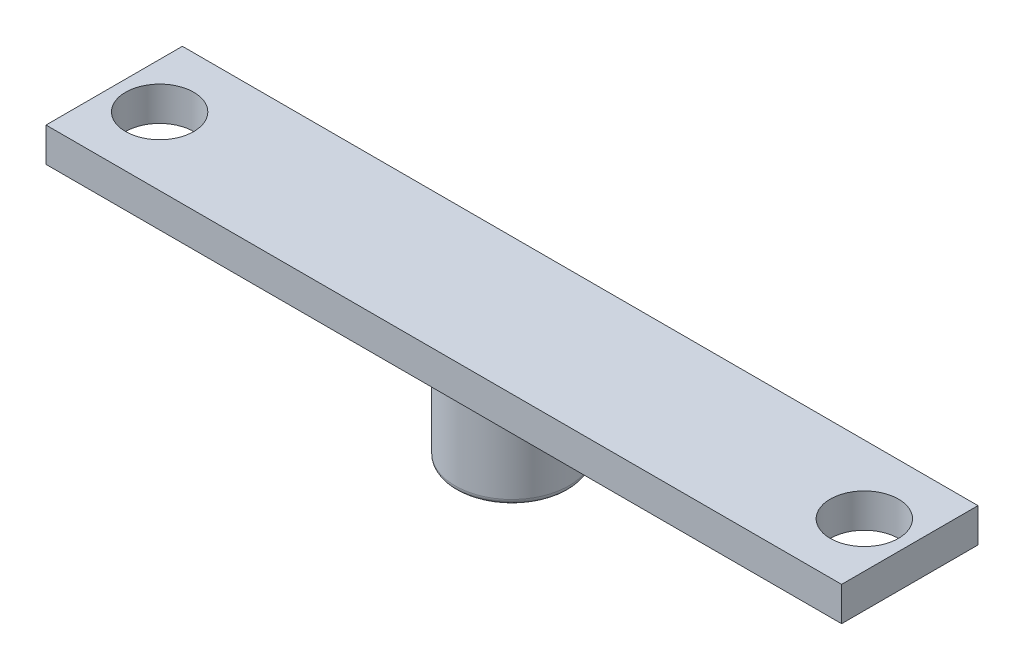
ISO-10303-21;
HEADER;
FILE_DESCRIPTION(('STEP AP214'),'2;1');
FILE_NAME('part.step','',(''),(''),'','','');
FILE_SCHEMA(('AUTOMOTIVE_DESIGN { 1 0 10303 214 1 1 1 1 }'));
ENDSEC;
DATA;
#1=APPLICATION_CONTEXT('core data for automotive mechanical design processes');
#2=APPLICATION_PROTOCOL_DEFINITION('international standard','automotive_design',2000,#1);
#3=PRODUCT_CONTEXT('',#1,'mechanical');
#4=PRODUCT('Part','Part','',(#3));
#5=PRODUCT_RELATED_PRODUCT_CATEGORY('part','',(#4));
#6=PRODUCT_DEFINITION_FORMATION('','',#4);
#7=PRODUCT_DEFINITION_CONTEXT('part definition',#1,'design');
#8=PRODUCT_DEFINITION('design','',#6,#7);
#9=PRODUCT_DEFINITION_SHAPE('','',#8);
#10=(LENGTH_UNIT() NAMED_UNIT(*) SI_UNIT(.MILLI.,.METRE.));
#11=(NAMED_UNIT(*) PLANE_ANGLE_UNIT() SI_UNIT($,.RADIAN.));
#12=(NAMED_UNIT(*) SI_UNIT($,.STERADIAN.) SOLID_ANGLE_UNIT());
#13=UNCERTAINTY_MEASURE_WITH_UNIT(LENGTH_MEASURE(1.E-05),#10,'distance_accuracy_value','');
#14=(GEOMETRIC_REPRESENTATION_CONTEXT(3) GLOBAL_UNCERTAINTY_ASSIGNED_CONTEXT((#13)) GLOBAL_UNIT_ASSIGNED_CONTEXT((#10,
#11,#12)) REPRESENTATION_CONTEXT('',''));
#15=CARTESIAN_POINT('',(0.,0.,0.));
#16=DIRECTION('',(0.,0.,1.));
#17=DIRECTION('',(1.,0.,0.));
#18=AXIS2_PLACEMENT_3D('',#15,#16,#17);
#19=CARTESIAN_POINT('',(35.,3.,6.));
#20=DIRECTION('',(-1.,0.,0.));
#21=DIRECTION('',(0.,0.,1.));
#22=AXIS2_PLACEMENT_3D('',#19,#20,#21);
#23=PLANE('',#22);
#24=DIRECTION('',(0.,0.,-1.));
#25=VECTOR('',#24,1.);
#26=CARTESIAN_POINT('',(35.,0.,6.));
#27=LINE('',#26,#25);
#28=CARTESIAN_POINT('',(35.,0.,6.));
#29=VERTEX_POINT('',#28);
#30=CARTESIAN_POINT('',(35.,0.,-6.));
#31=VERTEX_POINT('',#30);
#32=EDGE_CURVE('E110',#29,#31,#27,.T.);
#33=ORIENTED_EDGE('',*,*,#32,.T.);
#34=DIRECTION('',(0.,-1.,0.));
#35=VECTOR('',#34,1.);
#36=CARTESIAN_POINT('',(35.,3.,-6.));
#37=LINE('',#36,#35);
#38=CARTESIAN_POINT('',(35.,3.,-6.));
#39=VERTEX_POINT('',#38);
#40=EDGE_CURVE('E98',#39,#31,#37,.T.);
#41=ORIENTED_EDGE('',*,*,#40,.F.);
#42=DIRECTION('',(0.,0.,-1.));
#43=VECTOR('',#42,1.);
#44=CARTESIAN_POINT('',(35.,3.,6.));
#45=LINE('',#44,#43);
#46=CARTESIAN_POINT('',(35.,3.,6.));
#47=VERTEX_POINT('',#46);
#48=EDGE_CURVE('E95',#47,#39,#45,.T.);
#49=ORIENTED_EDGE('',*,*,#48,.F.);
#50=DIRECTION('',(0.,-1.,0.));
#51=VECTOR('',#50,1.);
#52=CARTESIAN_POINT('',(35.,3.,6.));
#53=LINE('',#52,#51);
#54=EDGE_CURVE('E103',#47,#29,#53,.T.);
#55=ORIENTED_EDGE('',*,*,#54,.T.);
#56=EDGE_LOOP('',(#33,#41,#49,#55));
#57=FACE_BOUND('',#56,.T.);
#58=ADVANCED_FACE('F39',(#57),#23,.F.);
#59=CARTESIAN_POINT('',(-35.,3.,-6.));
#60=DIRECTION('',(0.,0.,1.));
#61=DIRECTION('',(1.,0.,0.));
#62=AXIS2_PLACEMENT_3D('',#59,#60,#61);
#63=PLANE('',#62);
#64=DIRECTION('',(-1.,0.,0.));
#65=VECTOR('',#64,1.);
#66=CARTESIAN_POINT('',(-35.,0.,-6.));
#67=LINE('',#66,#65);
#68=CARTESIAN_POINT('',(-35.,0.,-6.));
#69=VERTEX_POINT('',#68);
#70=EDGE_CURVE('E100',#31,#69,#67,.T.);
#71=ORIENTED_EDGE('',*,*,#70,.T.);
#72=DIRECTION('',(0.,-1.,0.));
#73=VECTOR('',#72,1.);
#74=CARTESIAN_POINT('',(-35.,3.,-6.));
#75=LINE('',#74,#73);
#76=CARTESIAN_POINT('',(-35.,3.,-6.));
#77=VERTEX_POINT('',#76);
#78=EDGE_CURVE('E92',#77,#69,#75,.T.);
#79=ORIENTED_EDGE('',*,*,#78,.F.);
#80=DIRECTION('',(-1.,0.,0.));
#81=VECTOR('',#80,1.);
#82=CARTESIAN_POINT('',(-35.,3.,-6.));
#83=LINE('',#82,#81);
#84=EDGE_CURVE('E87',#39,#77,#83,.T.);
#85=ORIENTED_EDGE('',*,*,#84,.F.);
#86=ORIENTED_EDGE('',*,*,#40,.T.);
#87=EDGE_LOOP('',(#71,#79,#85,#86));
#88=FACE_BOUND('',#87,.T.);
#89=ADVANCED_FACE('F96',(#88),#63,.F.);
#90=CARTESIAN_POINT('',(-35.,3.,6.));
#91=DIRECTION('',(1.,0.,0.));
#92=DIRECTION('',(0.,0.,-1.));
#93=AXIS2_PLACEMENT_3D('',#90,#91,#92);
#94=PLANE('',#93);
#95=DIRECTION('',(0.,0.,1.));
#96=VECTOR('',#95,1.);
#97=CARTESIAN_POINT('',(-35.,0.,6.));
#98=LINE('',#97,#96);
#99=CARTESIAN_POINT('',(-35.,0.,6.));
#100=VERTEX_POINT('',#99);
#101=EDGE_CURVE('E71',#69,#100,#98,.T.);
#102=ORIENTED_EDGE('',*,*,#101,.T.);
#103=DIRECTION('',(0.,-1.,0.));
#104=VECTOR('',#103,1.);
#105=CARTESIAN_POINT('',(-35.,3.,6.));
#106=LINE('',#105,#104);
#107=CARTESIAN_POINT('',(-35.,3.,6.));
#108=VERTEX_POINT('',#107);
#109=EDGE_CURVE('E97',#108,#100,#106,.T.);
#110=ORIENTED_EDGE('',*,*,#109,.F.);
#111=DIRECTION('',(0.,0.,1.));
#112=VECTOR('',#111,1.);
#113=CARTESIAN_POINT('',(-35.,3.,6.));
#114=LINE('',#113,#112);
#115=EDGE_CURVE('E89',#77,#108,#114,.T.);
#116=ORIENTED_EDGE('',*,*,#115,.F.);
#117=ORIENTED_EDGE('',*,*,#78,.T.);
#118=EDGE_LOOP('',(#102,#110,#116,#117));
#119=FACE_BOUND('',#118,.T.);
#120=ADVANCED_FACE('F101',(#119),#94,.F.);
#121=CARTESIAN_POINT('',(-35.,3.,6.));
#122=DIRECTION('',(0.,0.,-1.));
#123=DIRECTION('',(-1.,0.,0.));
#124=AXIS2_PLACEMENT_3D('',#121,#122,#123);
#125=PLANE('',#124);
#126=DIRECTION('',(1.,0.,0.));
#127=VECTOR('',#126,1.);
#128=CARTESIAN_POINT('',(-35.,0.,6.));
#129=LINE('',#128,#127);
#130=EDGE_CURVE('E78',#100,#29,#129,.T.);
#131=ORIENTED_EDGE('',*,*,#130,.T.);
#132=ORIENTED_EDGE('',*,*,#54,.F.);
#133=DIRECTION('',(1.,0.,0.));
#134=VECTOR('',#133,1.);
#135=CARTESIAN_POINT('',(-35.,3.,6.));
#136=LINE('',#135,#134);
#137=EDGE_CURVE('E57',#108,#47,#136,.T.);
#138=ORIENTED_EDGE('',*,*,#137,.F.);
#139=ORIENTED_EDGE('',*,*,#109,.T.);
#140=EDGE_LOOP('',(#131,#132,#138,#139));
#141=FACE_BOUND('',#140,.T.);
#142=ADVANCED_FACE('F157',(#141),#125,.F.);
#143=CARTESIAN_POINT('',(0.,3.,0.));
#144=DIRECTION('',(0.,-1.,0.));
#145=DIRECTION('',(0.,0.,-1.));
#146=AXIS2_PLACEMENT_3D('',#143,#144,#145);
#147=PLANE('',#146);
#148=CARTESIAN_POINT('',(31.,3.,0.));
#149=DIRECTION('',(0.,1.,0.));
#150=DIRECTION('',(0.,0.,1.));
#151=AXIS2_PLACEMENT_3D('',#148,#149,#150);
#152=CIRCLE('',#151,3.);
#153=CARTESIAN_POINT('',(31.,3.,2.99999999999999));
#154=VERTEX_POINT('',#153);
#155=EDGE_CURVE('E178',#154,#154,#152,.T.);
#156=ORIENTED_EDGE('',*,*,#155,.F.);
#157=EDGE_LOOP('',(#156));
#158=FACE_BOUND('',#157,.T.);
#159=CARTESIAN_POINT('',(-31.,3.,0.));
#160=DIRECTION('',(0.,1.,0.));
#161=DIRECTION('',(0.,0.,1.));
#162=AXIS2_PLACEMENT_3D('',#159,#160,#161);
#163=CIRCLE('',#162,3.);
#164=CARTESIAN_POINT('',(-31.,3.,3.));
#165=VERTEX_POINT('',#164);
#166=EDGE_CURVE('E182',#165,#165,#163,.T.);
#167=ORIENTED_EDGE('',*,*,#166,.F.);
#168=EDGE_LOOP('',(#167));
#169=FACE_BOUND('',#168,.T.);
#170=ORIENTED_EDGE('',*,*,#48,.T.);
#171=ORIENTED_EDGE('',*,*,#84,.T.);
#172=ORIENTED_EDGE('',*,*,#115,.T.);
#173=ORIENTED_EDGE('',*,*,#137,.T.);
#174=EDGE_LOOP('',(#170,#171,#172,#173));
#175=FACE_BOUND('',#174,.T.);
#176=ADVANCED_FACE('F86',(#158,#169,#175),#147,.F.);
#177=CARTESIAN_POINT('',(0.,0.,0.));
#178=DIRECTION('',(0.,-1.,0.));
#179=DIRECTION('',(0.,0.,-1.));
#180=AXIS2_PLACEMENT_3D('',#177,#178,#179);
#181=PLANE('',#180);
#182=CARTESIAN_POINT('',(0.,0.,0.));
#183=DIRECTION('',(0.,-1.,0.));
#184=DIRECTION('',(0.,0.,-1.));
#185=AXIS2_PLACEMENT_3D('',#182,#183,#184);
#186=CIRCLE('',#185,5.5);
#187=CARTESIAN_POINT('',(0.,0.,-5.5));
#188=VERTEX_POINT('',#187);
#189=EDGE_CURVE('E48',#188,#188,#186,.F.);
#190=ORIENTED_EDGE('',*,*,#189,.T.);
#191=EDGE_LOOP('',(#190));
#192=FACE_BOUND('',#191,.T.);
#193=CARTESIAN_POINT('',(31.,0.,0.));
#194=DIRECTION('',(0.,1.,0.));
#195=DIRECTION('',(0.,0.,1.));
#196=AXIS2_PLACEMENT_3D('',#193,#194,#195);
#197=CIRCLE('',#196,3.);
#198=CARTESIAN_POINT('',(31.,0.,2.99999999999999));
#199=VERTEX_POINT('',#198);
#200=EDGE_CURVE('E109',#199,#199,#197,.T.);
#201=ORIENTED_EDGE('',*,*,#200,.T.);
#202=EDGE_LOOP('',(#201));
#203=FACE_BOUND('',#202,.T.);
#204=CARTESIAN_POINT('',(-31.,0.,0.));
#205=DIRECTION('',(0.,1.,0.));
#206=DIRECTION('',(0.,0.,1.));
#207=AXIS2_PLACEMENT_3D('',#204,#205,#206);
#208=CIRCLE('',#207,3.);
#209=CARTESIAN_POINT('',(-31.,0.,3.));
#210=VERTEX_POINT('',#209);
#211=EDGE_CURVE('E183',#210,#210,#208,.T.);
#212=ORIENTED_EDGE('',*,*,#211,.T.);
#213=EDGE_LOOP('',(#212));
#214=FACE_BOUND('',#213,.T.);
#215=ORIENTED_EDGE('',*,*,#32,.F.);
#216=ORIENTED_EDGE('',*,*,#130,.F.);
#217=ORIENTED_EDGE('',*,*,#101,.F.);
#218=ORIENTED_EDGE('',*,*,#70,.F.);
#219=EDGE_LOOP('',(#215,#216,#217,#218));
#220=FACE_BOUND('',#219,.T.);
#221=ADVANCED_FACE('F123',(#192,#203,#214,#220),#181,.T.);
#222=CARTESIAN_POINT('',(-31.,0.,0.));
#223=DIRECTION('',(0.,1.,0.));
#224=DIRECTION('',(0.,0.,1.));
#225=AXIS2_PLACEMENT_3D('',#222,#223,#224);
#226=CYLINDRICAL_SURFACE('',#225,3.);
#227=ORIENTED_EDGE('',*,*,#211,.F.);
#228=EDGE_LOOP('',(#227));
#229=FACE_BOUND('',#228,.T.);
#230=ORIENTED_EDGE('',*,*,#166,.T.);
#231=EDGE_LOOP('',(#230));
#232=FACE_BOUND('',#231,.T.);
#233=ADVANCED_FACE('F163',(#229,#232),#226,.F.);
#234=CARTESIAN_POINT('',(31.,0.,0.));
#235=DIRECTION('',(0.,1.,0.));
#236=DIRECTION('',(0.,0.,1.));
#237=AXIS2_PLACEMENT_3D('',#234,#235,#236);
#238=CYLINDRICAL_SURFACE('',#237,3.);
#239=ORIENTED_EDGE('',*,*,#200,.F.);
#240=EDGE_LOOP('',(#239));
#241=FACE_BOUND('',#240,.T.);
#242=ORIENTED_EDGE('',*,*,#155,.T.);
#243=EDGE_LOOP('',(#242));
#244=FACE_BOUND('',#243,.T.);
#245=ADVANCED_FACE('F139',(#241,#244),#238,.F.);
#246=CARTESIAN_POINT('',(0.,-8.,0.));
#247=DIRECTION('',(0.,1.,0.));
#248=DIRECTION('',(0.,0.,1.));
#249=AXIS2_PLACEMENT_3D('',#246,#247,#248);
#250=CYLINDRICAL_SURFACE('',#249,5.);
#251=CARTESIAN_POINT('',(0.,-0.5,0.));
#252=DIRECTION('',(0.,-1.,0.));
#253=DIRECTION('',(0.,0.,-1.));
#254=AXIS2_PLACEMENT_3D('',#251,#252,#253);
#255=CIRCLE('',#254,5.);
#256=CARTESIAN_POINT('',(0.,-0.5,-5.));
#257=VERTEX_POINT('',#256);
#258=EDGE_CURVE('E119',#257,#257,#255,.T.);
#259=ORIENTED_EDGE('',*,*,#258,.T.);
#260=EDGE_LOOP('',(#259));
#261=FACE_BOUND('',#260,.T.);
#262=CARTESIAN_POINT('',(0.,-7.5,0.));
#263=DIRECTION('',(0.,-1.,0.));
#264=DIRECTION('',(0.,0.,-1.));
#265=AXIS2_PLACEMENT_3D('',#262,#263,#264);
#266=CIRCLE('',#265,5.);
#267=CARTESIAN_POINT('',(0.,-7.5,-5.));
#268=VERTEX_POINT('',#267);
#269=EDGE_CURVE('E120',#268,#268,#266,.F.);
#270=ORIENTED_EDGE('',*,*,#269,.T.);
#271=EDGE_LOOP('',(#270));
#272=FACE_BOUND('',#271,.T.);
#273=ADVANCED_FACE('F133',(#261,#272),#250,.T.);
#274=CARTESIAN_POINT('',(0.,-8.,0.));
#275=DIRECTION('',(0.,-1.,0.));
#276=DIRECTION('',(0.,0.,-1.));
#277=AXIS2_PLACEMENT_3D('',#274,#275,#276);
#278=PLANE('',#277);
#279=CARTESIAN_POINT('',(0.,-8.,0.));
#280=DIRECTION('',(0.,-1.,0.));
#281=DIRECTION('',(0.,0.,-1.));
#282=AXIS2_PLACEMENT_3D('',#279,#280,#281);
#283=CIRCLE('',#282,4.5);
#284=CARTESIAN_POINT('',(0.,-8.,-4.5));
#285=VERTEX_POINT('',#284);
#286=EDGE_CURVE('E11',#285,#285,#283,.T.);
#287=ORIENTED_EDGE('',*,*,#286,.T.);
#288=EDGE_LOOP('',(#287));
#289=FACE_BOUND('',#288,.T.);
#290=ADVANCED_FACE('F131',(#289),#278,.T.);
#291=CARTESIAN_POINT('',(0.,-0.5,0.));
#292=DIRECTION('',(0.,-1.,0.));
#293=DIRECTION('',(0.,0.,-1.));
#294=AXIS2_PLACEMENT_3D('',#291,#292,#293);
#295=TOROIDAL_SURFACE('',#294,5.5,0.5);
#296=ORIENTED_EDGE('',*,*,#189,.F.);
#297=EDGE_LOOP('',(#296));
#298=FACE_BOUND('',#297,.T.);
#299=ORIENTED_EDGE('',*,*,#258,.F.);
#300=EDGE_LOOP('',(#299));
#301=FACE_BOUND('',#300,.T.);
#302=ADVANCED_FACE('F126',(#298,#301),#295,.F.);
#303=CARTESIAN_POINT('',(0.,-7.5,0.));
#304=DIRECTION('',(0.,-1.,0.));
#305=DIRECTION('',(0.,0.,-1.));
#306=AXIS2_PLACEMENT_3D('',#303,#304,#305);
#307=TOROIDAL_SURFACE('',#306,4.5,0.5);
#308=ORIENTED_EDGE('',*,*,#269,.F.);
#309=EDGE_LOOP('',(#308));
#310=FACE_BOUND('',#309,.T.);
#311=ORIENTED_EDGE('',*,*,#286,.F.);
#312=EDGE_LOOP('',(#311));
#313=FACE_BOUND('',#312,.T.);
#314=ADVANCED_FACE('F41',(#310,#313),#307,.T.);
#315=CLOSED_SHELL('',(#58,#89,#120,#142,#176,#221,#233,#245,#273,#290,#302,#314));
#316=MANIFOLD_SOLID_BREP('B2',#315);
#317=ADVANCED_BREP_SHAPE_REPRESENTATION('',(#18,#316),#14);
#318=SHAPE_DEFINITION_REPRESENTATION(#9,#317);
ENDSEC;
END-ISO-10303-21;
